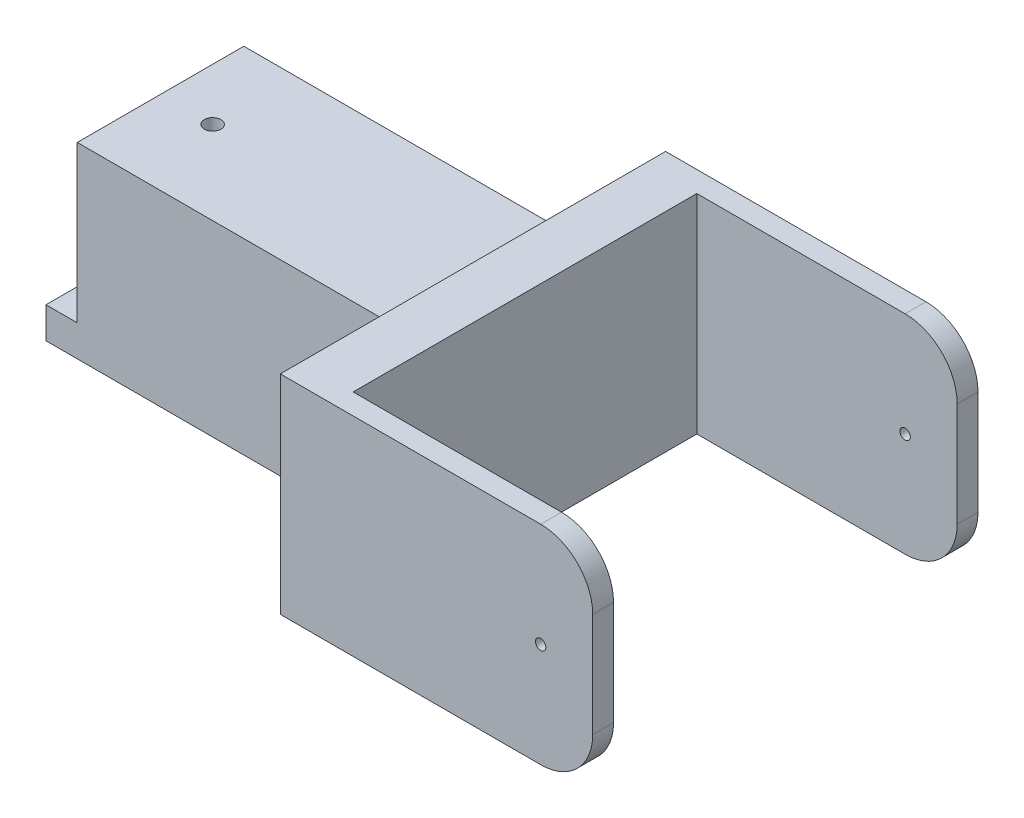
ISO-10303-21;
HEADER;
FILE_DESCRIPTION(('STEP AP214'),'2;1');
FILE_NAME('part.step','',(''),(''),'','','');
FILE_SCHEMA(('AUTOMOTIVE_DESIGN { 1 0 10303 214 1 1 1 1 }'));
ENDSEC;
DATA;
#1=APPLICATION_CONTEXT('core data for automotive mechanical design processes');
#2=APPLICATION_PROTOCOL_DEFINITION('international standard','automotive_design',2000,#1);
#3=PRODUCT_CONTEXT('',#1,'mechanical');
#4=PRODUCT('Part','Part','',(#3));
#5=PRODUCT_RELATED_PRODUCT_CATEGORY('part','',(#4));
#6=PRODUCT_DEFINITION_FORMATION('','',#4);
#7=PRODUCT_DEFINITION_CONTEXT('part definition',#1,'design');
#8=PRODUCT_DEFINITION('design','',#6,#7);
#9=PRODUCT_DEFINITION_SHAPE('','',#8);
#10=(LENGTH_UNIT() NAMED_UNIT(*) SI_UNIT(.MILLI.,.METRE.));
#11=(NAMED_UNIT(*) PLANE_ANGLE_UNIT() SI_UNIT($,.RADIAN.));
#12=(NAMED_UNIT(*) SI_UNIT($,.STERADIAN.) SOLID_ANGLE_UNIT());
#13=UNCERTAINTY_MEASURE_WITH_UNIT(LENGTH_MEASURE(1.E-05),#10,'distance_accuracy_value','');
#14=(GEOMETRIC_REPRESENTATION_CONTEXT(3) GLOBAL_UNCERTAINTY_ASSIGNED_CONTEXT((#13)) GLOBAL_UNIT_ASSIGNED_CONTEXT((#10,
#11,#12)) REPRESENTATION_CONTEXT('',''));
#15=CARTESIAN_POINT('',(0.,0.,0.));
#16=DIRECTION('',(0.,0.,1.));
#17=DIRECTION('',(1.,0.,0.));
#18=AXIS2_PLACEMENT_3D('',#15,#16,#17);
#19=CARTESIAN_POINT('',(20.,38.,0.));
#20=DIRECTION('',(1.,0.,0.));
#21=DIRECTION('',(0.,0.,-1.));
#22=AXIS2_PLACEMENT_3D('',#19,#20,#21);
#23=PLANE('',#22);
#24=DIRECTION('',(0.,0.,1.));
#25=VECTOR('',#24,1.);
#26=CARTESIAN_POINT('',(20.,19.,-18.5));
#27=LINE('',#26,#25);
#28=CARTESIAN_POINT('',(20.,19.,-16.5));
#29=VERTEX_POINT('',#28);
#30=CARTESIAN_POINT('',(20.,19.,16.5));
#31=VERTEX_POINT('',#30);
#32=EDGE_CURVE('E235',#29,#31,#27,.T.);
#33=ORIENTED_EDGE('',*,*,#32,.F.);
#34=DIRECTION('',(0.,1.,0.));
#35=VECTOR('',#34,1.);
#36=CARTESIAN_POINT('',(20.,19.,-16.5));
#37=LINE('',#36,#35);
#38=CARTESIAN_POINT('',(20.,39.,-16.5));
#39=VERTEX_POINT('',#38);
#40=EDGE_CURVE('E508',#29,#39,#37,.T.);
#41=ORIENTED_EDGE('',*,*,#40,.T.);
#42=DIRECTION('',(0.,0.,-1.));
#43=VECTOR('',#42,1.);
#44=CARTESIAN_POINT('',(20.,39.,-18.5));
#45=LINE('',#44,#43);
#46=CARTESIAN_POINT('',(20.,39.,16.5));
#47=VERTEX_POINT('',#46);
#48=EDGE_CURVE('E237',#47,#39,#45,.T.);
#49=ORIENTED_EDGE('',*,*,#48,.F.);
#50=DIRECTION('',(0.,-1.,0.));
#51=VECTOR('',#50,1.);
#52=CARTESIAN_POINT('',(20.,19.,16.5));
#53=LINE('',#52,#51);
#54=EDGE_CURVE('E220',#47,#31,#53,.T.);
#55=ORIENTED_EDGE('',*,*,#54,.T.);
#56=EDGE_LOOP('',(#33,#41,#49,#55));
#57=FACE_BOUND('',#56,.T.);
#58=ADVANCED_FACE('F41',(#57),#23,.T.);
#59=CARTESIAN_POINT('',(-15.,36.,8.00000000000001));
#60=DIRECTION('',(1.,0.,0.));
#61=DIRECTION('',(0.,0.,-1.));
#62=AXIS2_PLACEMENT_3D('',#59,#60,#61);
#63=PLANE('',#62);
#64=DIRECTION('',(0.,1.,0.));
#65=VECTOR('',#64,1.);
#66=CARTESIAN_POINT('',(-15.,36.,8.00000000000001));
#67=LINE('',#66,#65);
#68=CARTESIAN_POINT('',(-15.,23.,8.));
#69=VERTEX_POINT('',#68);
#70=CARTESIAN_POINT('',(-15.,38.,8.00000000000001));
#71=VERTEX_POINT('',#70);
#72=EDGE_CURVE('E449',#69,#71,#67,.T.);
#73=ORIENTED_EDGE('',*,*,#72,.T.);
#74=DIRECTION('',(0.,0.,1.));
#75=VECTOR('',#74,1.);
#76=CARTESIAN_POINT('',(-15.,38.,8.00000000000001));
#77=LINE('',#76,#75);
#78=CARTESIAN_POINT('',(-15.,38.,-7.99999999999999));
#79=VERTEX_POINT('',#78);
#80=EDGE_CURVE('E423',#79,#71,#77,.T.);
#81=ORIENTED_EDGE('',*,*,#80,.F.);
#82=DIRECTION('',(0.,1.,0.));
#83=VECTOR('',#82,1.);
#84=CARTESIAN_POINT('',(-15.,36.,-7.99999999999999));
#85=LINE('',#84,#83);
#86=CARTESIAN_POINT('',(-15.,23.,-8.));
#87=VERTEX_POINT('',#86);
#88=EDGE_CURVE('E437',#87,#79,#85,.T.);
#89=ORIENTED_EDGE('',*,*,#88,.F.);
#90=DIRECTION('',(0.,0.,-1.));
#91=VECTOR('',#90,1.);
#92=CARTESIAN_POINT('',(-15.,23.,8.));
#93=LINE('',#92,#91);
#94=CARTESIAN_POINT('',(-15.,23.,-2.25));
#95=VERTEX_POINT('',#94);
#96=EDGE_CURVE('E316',#95,#87,#93,.T.);
#97=ORIENTED_EDGE('',*,*,#96,.F.);
#98=DIRECTION('',(0.,1.,0.));
#99=VECTOR('',#98,1.);
#100=CARTESIAN_POINT('',(-15.,20.,-2.25));
#101=LINE('',#100,#99);
#102=CARTESIAN_POINT('',(-15.,33.,-2.24999999999999));
#103=VERTEX_POINT('',#102);
#104=EDGE_CURVE('E331',#95,#103,#101,.T.);
#105=ORIENTED_EDGE('',*,*,#104,.T.);
#106=DIRECTION('',(0.,0.,1.));
#107=VECTOR('',#106,1.);
#108=CARTESIAN_POINT('',(-15.,33.,-2.24999999999999));
#109=LINE('',#108,#107);
#110=CARTESIAN_POINT('',(-15.,33.,2.25000000000001));
#111=VERTEX_POINT('',#110);
#112=EDGE_CURVE('E359',#103,#111,#109,.T.);
#113=ORIENTED_EDGE('',*,*,#112,.T.);
#114=DIRECTION('',(0.,-1.,0.));
#115=VECTOR('',#114,1.);
#116=CARTESIAN_POINT('',(-15.,20.,2.25));
#117=LINE('',#116,#115);
#118=CARTESIAN_POINT('',(-15.,23.,2.25));
#119=VERTEX_POINT('',#118);
#120=EDGE_CURVE('E339',#111,#119,#117,.T.);
#121=ORIENTED_EDGE('',*,*,#120,.T.);
#122=EDGE_CURVE('E324',#69,#119,#93,.T.);
#123=ORIENTED_EDGE('',*,*,#122,.F.);
#124=EDGE_LOOP('',(#73,#81,#89,#97,#105,#113,#121,#123));
#125=FACE_BOUND('',#124,.T.);
#126=ADVANCED_FACE('F569',(#125),#63,.F.);
#127=CARTESIAN_POINT('',(15.,36.,8.00000000000001));
#128=DIRECTION('',(0.,0.,-1.));
#129=DIRECTION('',(-1.,0.,0.));
#130=AXIS2_PLACEMENT_3D('',#127,#128,#129);
#131=PLANE('',#130);
#132=DIRECTION('',(0.,1.,0.));
#133=VECTOR('',#132,1.);
#134=CARTESIAN_POINT('',(15.,36.,8.00000000000001));
#135=LINE('',#134,#133);
#136=CARTESIAN_POINT('',(15.,20.,8.));
#137=VERTEX_POINT('',#136);
#138=CARTESIAN_POINT('',(15.,38.,8.00000000000001));
#139=VERTEX_POINT('',#138);
#140=EDGE_CURVE('E445',#137,#139,#135,.T.);
#141=ORIENTED_EDGE('',*,*,#140,.T.);
#142=DIRECTION('',(1.,0.,0.));
#143=VECTOR('',#142,1.);
#144=CARTESIAN_POINT('',(15.,38.,8.00000000000001));
#145=LINE('',#144,#143);
#146=EDGE_CURVE('E427',#71,#139,#145,.T.);
#147=ORIENTED_EDGE('',*,*,#146,.F.);
#148=ORIENTED_EDGE('',*,*,#72,.F.);
#149=DIRECTION('',(1.,0.,0.));
#150=VECTOR('',#149,1.);
#151=CARTESIAN_POINT('',(-13.,23.,8.));
#152=LINE('',#151,#150);
#153=CARTESIAN_POINT('',(-18.,23.,8.));
#154=VERTEX_POINT('',#153);
#155=EDGE_CURVE('E306',#154,#69,#152,.T.);
#156=ORIENTED_EDGE('',*,*,#155,.F.);
#157=DIRECTION('',(0.,-1.,0.));
#158=VECTOR('',#157,1.);
#159=CARTESIAN_POINT('',(-18.,23.,8.));
#160=LINE('',#159,#158);
#161=CARTESIAN_POINT('',(-18.,20.,8.));
#162=VERTEX_POINT('',#161);
#163=EDGE_CURVE('E312',#154,#162,#160,.T.);
#164=ORIENTED_EDGE('',*,*,#163,.T.);
#165=DIRECTION('',(1.,0.,0.));
#166=VECTOR('',#165,1.);
#167=CARTESIAN_POINT('',(-15.,20.,8.));
#168=LINE('',#167,#166);
#169=EDGE_CURVE('E412',#162,#137,#168,.T.);
#170=ORIENTED_EDGE('',*,*,#169,.T.);
#171=EDGE_LOOP('',(#141,#147,#148,#156,#164,#170));
#172=FACE_BOUND('',#171,.T.);
#173=ADVANCED_FACE('F574',(#172),#131,.F.);
#174=CARTESIAN_POINT('',(15.,36.,-7.99999999999999));
#175=DIRECTION('',(0.,0.,1.));
#176=DIRECTION('',(1.,0.,0.));
#177=AXIS2_PLACEMENT_3D('',#174,#175,#176);
#178=PLANE('',#177);
#179=DIRECTION('',(0.,-1.,0.));
#180=VECTOR('',#179,1.);
#181=CARTESIAN_POINT('',(-18.,23.,-8.));
#182=LINE('',#181,#180);
#183=CARTESIAN_POINT('',(-18.,23.,-8.));
#184=VERTEX_POINT('',#183);
#185=CARTESIAN_POINT('',(-18.,20.,-8.));
#186=VERTEX_POINT('',#185);
#187=EDGE_CURVE('E309',#184,#186,#182,.T.);
#188=ORIENTED_EDGE('',*,*,#187,.F.);
#189=DIRECTION('',(-1.,0.,0.));
#190=VECTOR('',#189,1.);
#191=CARTESIAN_POINT('',(-13.,23.,-8.));
#192=LINE('',#191,#190);
#193=EDGE_CURVE('E299',#87,#184,#192,.T.);
#194=ORIENTED_EDGE('',*,*,#193,.F.);
#195=ORIENTED_EDGE('',*,*,#88,.T.);
#196=DIRECTION('',(-1.,0.,0.));
#197=VECTOR('',#196,1.);
#198=CARTESIAN_POINT('',(15.,38.,-7.99999999999999));
#199=LINE('',#198,#197);
#200=CARTESIAN_POINT('',(15.,38.,-7.99999999999999));
#201=VERTEX_POINT('',#200);
#202=EDGE_CURVE('E434',#201,#79,#199,.T.);
#203=ORIENTED_EDGE('',*,*,#202,.F.);
#204=DIRECTION('',(0.,1.,0.));
#205=VECTOR('',#204,1.);
#206=CARTESIAN_POINT('',(15.,36.,-7.99999999999999));
#207=LINE('',#206,#205);
#208=CARTESIAN_POINT('',(15.,20.,-8.));
#209=VERTEX_POINT('',#208);
#210=EDGE_CURVE('E441',#209,#201,#207,.T.);
#211=ORIENTED_EDGE('',*,*,#210,.F.);
#212=DIRECTION('',(-1.,0.,0.));
#213=VECTOR('',#212,1.);
#214=CARTESIAN_POINT('',(10.2,20.,-8.));
#215=LINE('',#214,#213);
#216=EDGE_CURVE('E419',#209,#186,#215,.T.);
#217=ORIENTED_EDGE('',*,*,#216,.T.);
#218=EDGE_LOOP('',(#188,#194,#195,#203,#211,#217));
#219=FACE_BOUND('',#218,.T.);
#220=ADVANCED_FACE('F658',(#219),#178,.F.);
#221=CARTESIAN_POINT('',(0.,38.,0.));
#222=DIRECTION('',(0.,-1.,0.));
#223=DIRECTION('',(0.,0.,1.));
#224=AXIS2_PLACEMENT_3D('',#221,#222,#223);
#225=PLANE('',#224);
#226=CARTESIAN_POINT('',(-10.,38.,0.));
#227=DIRECTION('',(0.,-1.,0.));
#228=DIRECTION('',(0.,0.,-1.));
#229=AXIS2_PLACEMENT_3D('',#226,#227,#228);
#230=CIRCLE('',#229,0.800000000000001);
#231=CARTESIAN_POINT('',(-10.,38.,-0.799999999999994));
#232=VERTEX_POINT('',#231);
#233=EDGE_CURVE('E332',#232,#232,#230,.T.);
#234=ORIENTED_EDGE('',*,*,#233,.T.);
#235=EDGE_LOOP('',(#234));
#236=FACE_BOUND('',#235,.T.);
#237=ORIENTED_EDGE('',*,*,#80,.T.);
#238=ORIENTED_EDGE('',*,*,#146,.T.);
#239=DIRECTION('',(0.,0.,-1.));
#240=VECTOR('',#239,1.);
#241=CARTESIAN_POINT('',(15.,38.,8.00000000000001));
#242=LINE('',#241,#240);
#243=EDGE_CURVE('E431',#139,#201,#242,.T.);
#244=ORIENTED_EDGE('',*,*,#243,.T.);
#245=ORIENTED_EDGE('',*,*,#202,.T.);
#246=EDGE_LOOP('',(#237,#238,#244,#245));
#247=FACE_BOUND('',#246,.T.);
#248=ADVANCED_FACE('F651',(#236,#247),#225,.F.);
#249=CARTESIAN_POINT('',(0.,20.,0.));
#250=DIRECTION('',(0.,-1.,0.));
#251=DIRECTION('',(0.,0.,1.));
#252=AXIS2_PLACEMENT_3D('',#249,#250,#251);
#253=PLANE('',#252);
#254=CARTESIAN_POINT('',(-15.5009715513472,20.,0.));
#255=DIRECTION('',(0.,1.,0.));
#256=DIRECTION('',(0.,0.,1.));
#257=AXIS2_PLACEMENT_3D('',#254,#255,#256);
#258=CIRCLE('',#257,0.800000000000001);
#259=CARTESIAN_POINT('',(-15.5009715513472,20.,0.800000000000001));
#260=VERTEX_POINT('',#259);
#261=EDGE_CURVE('E281',#260,#260,#258,.T.);
#262=ORIENTED_EDGE('',*,*,#261,.T.);
#263=EDGE_LOOP('',(#262));
#264=FACE_BOUND('',#263,.T.);
#265=CARTESIAN_POINT('',(12.,20.,0.));
#266=DIRECTION('',(0.,1.,0.));
#267=DIRECTION('',(0.,0.,1.));
#268=AXIS2_PLACEMENT_3D('',#265,#266,#267);
#269=CIRCLE('',#268,0.800000000000001);
#270=CARTESIAN_POINT('',(12.,20.,0.800000000000001));
#271=VERTEX_POINT('',#270);
#272=EDGE_CURVE('E291',#271,#271,#269,.T.);
#273=ORIENTED_EDGE('',*,*,#272,.T.);
#274=EDGE_LOOP('',(#273));
#275=FACE_BOUND('',#274,.T.);
#276=DIRECTION('',(-1.,0.,0.));
#277=VECTOR('',#276,1.);
#278=CARTESIAN_POINT('',(-13.,20.,-6.1));
#279=LINE('',#278,#277);
#280=CARTESIAN_POINT('',(10.2,20.,-6.1));
#281=VERTEX_POINT('',#280);
#282=CARTESIAN_POINT('',(-13.,20.,-6.1));
#283=VERTEX_POINT('',#282);
#284=EDGE_CURVE('E370',#281,#283,#279,.T.);
#285=ORIENTED_EDGE('',*,*,#284,.T.);
#286=DIRECTION('',(0.,0.,1.));
#287=VECTOR('',#286,1.);
#288=CARTESIAN_POINT('',(-13.,20.,-6.1));
#289=LINE('',#288,#287);
#290=CARTESIAN_POINT('',(-13.,20.,6.1));
#291=VERTEX_POINT('',#290);
#292=EDGE_CURVE('E375',#283,#291,#289,.T.);
#293=ORIENTED_EDGE('',*,*,#292,.T.);
#294=DIRECTION('',(1.,0.,0.));
#295=VECTOR('',#294,1.);
#296=CARTESIAN_POINT('',(-13.,20.,6.1));
#297=LINE('',#296,#295);
#298=CARTESIAN_POINT('',(10.2,20.,6.1));
#299=VERTEX_POINT('',#298);
#300=EDGE_CURVE('E379',#291,#299,#297,.T.);
#301=ORIENTED_EDGE('',*,*,#300,.T.);
#302=DIRECTION('',(0.,0.,-1.));
#303=VECTOR('',#302,1.);
#304=CARTESIAN_POINT('',(10.2,20.,-6.1));
#305=LINE('',#304,#303);
#306=EDGE_CURVE('E366',#299,#281,#305,.T.);
#307=ORIENTED_EDGE('',*,*,#306,.T.);
#308=EDGE_LOOP('',(#285,#293,#301,#307));
#309=FACE_BOUND('',#308,.T.);
#310=ORIENTED_EDGE('',*,*,#216,.F.);
#311=DIRECTION('',(0.,0.,-1.));
#312=VECTOR('',#311,1.);
#313=CARTESIAN_POINT('',(15.,20.,-8.));
#314=LINE('',#313,#312);
#315=EDGE_CURVE('E416',#137,#209,#314,.T.);
#316=ORIENTED_EDGE('',*,*,#315,.F.);
#317=ORIENTED_EDGE('',*,*,#169,.F.);
#318=DIRECTION('',(0.,0.,1.));
#319=VECTOR('',#318,1.);
#320=CARTESIAN_POINT('',(-18.,20.,-8.));
#321=LINE('',#320,#319);
#322=EDGE_CURVE('E290',#186,#162,#321,.T.);
#323=ORIENTED_EDGE('',*,*,#322,.F.);
#324=EDGE_LOOP('',(#310,#316,#317,#323));
#325=FACE_BOUND('',#324,.T.);
#326=ADVANCED_FACE('F647',(#264,#275,#309,#325),#253,.T.);
#327=CARTESIAN_POINT('',(10.2,20.,-6.1));
#328=DIRECTION('',(-1.,0.,0.));
#329=DIRECTION('',(0.,0.,1.));
#330=AXIS2_PLACEMENT_3D('',#327,#328,#329);
#331=PLANE('',#330);
#332=DIRECTION('',(0.,1.,0.));
#333=VECTOR('',#332,1.);
#334=CARTESIAN_POINT('',(10.2,20.,-6.1));
#335=LINE('',#334,#333);
#336=CARTESIAN_POINT('',(10.2,36.,-6.1));
#337=VERTEX_POINT('',#336);
#338=EDGE_CURVE('E408',#281,#337,#335,.T.);
#339=ORIENTED_EDGE('',*,*,#338,.F.);
#340=ORIENTED_EDGE('',*,*,#306,.F.);
#341=DIRECTION('',(0.,1.,0.));
#342=VECTOR('',#341,1.);
#343=CARTESIAN_POINT('',(10.2,20.,6.1));
#344=LINE('',#343,#342);
#345=CARTESIAN_POINT('',(10.2,36.,6.10000000000001));
#346=VERTEX_POINT('',#345);
#347=EDGE_CURVE('E383',#299,#346,#344,.T.);
#348=ORIENTED_EDGE('',*,*,#347,.T.);
#349=DIRECTION('',(0.,0.,-1.));
#350=VECTOR('',#349,1.);
#351=CARTESIAN_POINT('',(10.2,36.,-6.1));
#352=LINE('',#351,#350);
#353=EDGE_CURVE('E365',#346,#337,#352,.T.);
#354=ORIENTED_EDGE('',*,*,#353,.T.);
#355=EDGE_LOOP('',(#339,#340,#348,#354));
#356=FACE_BOUND('',#355,.T.);
#357=ADVANCED_FACE('F643',(#356),#331,.T.);
#358=CARTESIAN_POINT('',(-13.,20.,-6.1));
#359=DIRECTION('',(0.,0.,1.));
#360=DIRECTION('',(1.,0.,0.));
#361=AXIS2_PLACEMENT_3D('',#358,#359,#360);
#362=PLANE('',#361);
#363=DIRECTION('',(-1.,0.,0.));
#364=VECTOR('',#363,1.);
#365=CARTESIAN_POINT('',(-13.,36.,-6.1));
#366=LINE('',#365,#364);
#367=CARTESIAN_POINT('',(-13.,36.,-6.1));
#368=VERTEX_POINT('',#367);
#369=EDGE_CURVE('E387',#337,#368,#366,.T.);
#370=ORIENTED_EDGE('',*,*,#369,.T.);
#371=DIRECTION('',(0.,1.,0.));
#372=VECTOR('',#371,1.);
#373=CARTESIAN_POINT('',(-13.,20.,-6.1));
#374=LINE('',#373,#372);
#375=EDGE_CURVE('E404',#283,#368,#374,.T.);
#376=ORIENTED_EDGE('',*,*,#375,.F.);
#377=ORIENTED_EDGE('',*,*,#284,.F.);
#378=ORIENTED_EDGE('',*,*,#338,.T.);
#379=EDGE_LOOP('',(#370,#376,#377,#378));
#380=FACE_BOUND('',#379,.T.);
#381=ADVANCED_FACE('F639',(#380),#362,.T.);
#382=CARTESIAN_POINT('',(-13.,20.,-6.1));
#383=DIRECTION('',(1.,0.,0.));
#384=DIRECTION('',(0.,0.,-1.));
#385=AXIS2_PLACEMENT_3D('',#382,#383,#384);
#386=PLANE('',#385);
#387=DIRECTION('',(0.,1.,0.));
#388=VECTOR('',#387,1.);
#389=CARTESIAN_POINT('',(-13.,20.,2.25));
#390=LINE('',#389,#388);
#391=CARTESIAN_POINT('',(-13.,23.,2.25));
#392=VERTEX_POINT('',#391);
#393=CARTESIAN_POINT('',(-13.,33.,2.25000000000001));
#394=VERTEX_POINT('',#393);
#395=EDGE_CURVE('E343',#392,#394,#390,.T.);
#396=ORIENTED_EDGE('',*,*,#395,.T.);
#397=DIRECTION('',(0.,0.,-1.));
#398=VECTOR('',#397,1.);
#399=CARTESIAN_POINT('',(-13.,33.,-2.24999999999999));
#400=LINE('',#399,#398);
#401=CARTESIAN_POINT('',(-13.,33.,-2.24999999999999));
#402=VERTEX_POINT('',#401);
#403=EDGE_CURVE('E347',#394,#402,#400,.T.);
#404=ORIENTED_EDGE('',*,*,#403,.T.);
#405=DIRECTION('',(0.,-1.,0.));
#406=VECTOR('',#405,1.);
#407=CARTESIAN_POINT('',(-13.,20.,-2.25));
#408=LINE('',#407,#406);
#409=CARTESIAN_POINT('',(-13.,23.,-2.25));
#410=VERTEX_POINT('',#409);
#411=EDGE_CURVE('E351',#402,#410,#408,.T.);
#412=ORIENTED_EDGE('',*,*,#411,.T.);
#413=DIRECTION('',(0.,0.,-1.));
#414=VECTOR('',#413,1.);
#415=CARTESIAN_POINT('',(-13.,23.,-8.));
#416=LINE('',#415,#414);
#417=EDGE_CURVE('E295',#392,#410,#416,.T.);
#418=ORIENTED_EDGE('',*,*,#417,.F.);
#419=EDGE_LOOP('',(#396,#404,#412,#418));
#420=FACE_BOUND('',#419,.T.);
#421=DIRECTION('',(0.,1.,0.));
#422=VECTOR('',#421,1.);
#423=CARTESIAN_POINT('',(-13.,20.,6.1));
#424=LINE('',#423,#422);
#425=CARTESIAN_POINT('',(-13.,36.,6.10000000000001));
#426=VERTEX_POINT('',#425);
#427=EDGE_CURVE('E400',#291,#426,#424,.T.);
#428=ORIENTED_EDGE('',*,*,#427,.F.);
#429=ORIENTED_EDGE('',*,*,#292,.F.);
#430=ORIENTED_EDGE('',*,*,#375,.T.);
#431=DIRECTION('',(0.,0.,1.));
#432=VECTOR('',#431,1.);
#433=CARTESIAN_POINT('',(-13.,36.,-6.1));
#434=LINE('',#433,#432);
#435=EDGE_CURVE('E391',#368,#426,#434,.T.);
#436=ORIENTED_EDGE('',*,*,#435,.T.);
#437=EDGE_LOOP('',(#428,#429,#430,#436));
#438=FACE_BOUND('',#437,.T.);
#439=ADVANCED_FACE('F635',(#420,#438),#386,.T.);
#440=CARTESIAN_POINT('',(-13.,20.,6.1));
#441=DIRECTION('',(0.,0.,-1.));
#442=DIRECTION('',(-1.,0.,0.));
#443=AXIS2_PLACEMENT_3D('',#440,#441,#442);
#444=PLANE('',#443);
#445=DIRECTION('',(1.,0.,0.));
#446=VECTOR('',#445,1.);
#447=CARTESIAN_POINT('',(-13.,36.,6.10000000000001));
#448=LINE('',#447,#446);
#449=EDGE_CURVE('E371',#426,#346,#448,.T.);
#450=ORIENTED_EDGE('',*,*,#449,.T.);
#451=ORIENTED_EDGE('',*,*,#347,.F.);
#452=ORIENTED_EDGE('',*,*,#300,.F.);
#453=ORIENTED_EDGE('',*,*,#427,.T.);
#454=EDGE_LOOP('',(#450,#451,#452,#453));
#455=FACE_BOUND('',#454,.T.);
#456=ADVANCED_FACE('F632',(#455),#444,.T.);
#457=CARTESIAN_POINT('',(0.,36.,0.));
#458=DIRECTION('',(0.,-1.,0.));
#459=DIRECTION('',(0.,0.,1.));
#460=AXIS2_PLACEMENT_3D('',#457,#458,#459);
#461=PLANE('',#460);
#462=CARTESIAN_POINT('',(-10.,36.,0.));
#463=DIRECTION('',(0.,-1.,0.));
#464=DIRECTION('',(0.,0.,-1.));
#465=AXIS2_PLACEMENT_3D('',#462,#463,#464);
#466=CIRCLE('',#465,0.800000000000001);
#467=CARTESIAN_POINT('',(-10.,36.,-0.799999999999994));
#468=VERTEX_POINT('',#467);
#469=EDGE_CURVE('E327',#468,#468,#466,.T.);
#470=ORIENTED_EDGE('',*,*,#469,.F.);
#471=EDGE_LOOP('',(#470));
#472=FACE_BOUND('',#471,.T.);
#473=ORIENTED_EDGE('',*,*,#353,.F.);
#474=ORIENTED_EDGE('',*,*,#449,.F.);
#475=ORIENTED_EDGE('',*,*,#435,.F.);
#476=ORIENTED_EDGE('',*,*,#369,.F.);
#477=EDGE_LOOP('',(#473,#474,#475,#476));
#478=FACE_BOUND('',#477,.T.);
#479=ADVANCED_FACE('F630',(#472,#478),#461,.T.);
#480=CARTESIAN_POINT('',(-15.001,20.,2.25));
#481=DIRECTION('',(0.,0.,1.));
#482=DIRECTION('',(0.,1.,0.));
#483=AXIS2_PLACEMENT_3D('',#480,#481,#482);
#484=PLANE('',#483);
#485=ORIENTED_EDGE('',*,*,#120,.F.);
#486=DIRECTION('',(1.,0.,0.));
#487=VECTOR('',#486,1.);
#488=CARTESIAN_POINT('',(-15.001,33.,2.25000000000001));
#489=LINE('',#488,#487);
#490=EDGE_CURVE('E355',#111,#394,#489,.T.);
#491=ORIENTED_EDGE('',*,*,#490,.T.);
#492=ORIENTED_EDGE('',*,*,#395,.F.);
#493=DIRECTION('',(1.,0.,0.));
#494=VECTOR('',#493,1.);
#495=CARTESIAN_POINT('',(-15.001,23.,2.25));
#496=LINE('',#495,#494);
#497=EDGE_CURVE('E323',#119,#392,#496,.T.);
#498=ORIENTED_EDGE('',*,*,#497,.F.);
#499=EDGE_LOOP('',(#485,#491,#492,#498));
#500=FACE_BOUND('',#499,.T.);
#501=ADVANCED_FACE('F623',(#500),#484,.F.);
#502=CARTESIAN_POINT('',(-15.001,20.,-2.25));
#503=DIRECTION('',(0.,0.,-1.));
#504=DIRECTION('',(0.,-1.,0.));
#505=AXIS2_PLACEMENT_3D('',#502,#503,#504);
#506=PLANE('',#505);
#507=ORIENTED_EDGE('',*,*,#411,.F.);
#508=DIRECTION('',(1.,0.,0.));
#509=VECTOR('',#508,1.);
#510=CARTESIAN_POINT('',(-15.001,33.,-2.24999999999999));
#511=LINE('',#510,#509);
#512=EDGE_CURVE('E356',#103,#402,#511,.T.);
#513=ORIENTED_EDGE('',*,*,#512,.F.);
#514=ORIENTED_EDGE('',*,*,#104,.F.);
#515=DIRECTION('',(-1.,0.,0.));
#516=VECTOR('',#515,1.);
#517=CARTESIAN_POINT('',(-15.001,23.,-2.25));
#518=LINE('',#517,#516);
#519=EDGE_CURVE('E453',#410,#95,#518,.T.);
#520=ORIENTED_EDGE('',*,*,#519,.F.);
#521=EDGE_LOOP('',(#507,#513,#514,#520));
#522=FACE_BOUND('',#521,.T.);
#523=ADVANCED_FACE('F620',(#522),#506,.F.);
#524=CARTESIAN_POINT('',(-15.001,33.,-2.24999999999999));
#525=DIRECTION('',(0.,1.,0.));
#526=DIRECTION('',(0.,0.,-1.));
#527=AXIS2_PLACEMENT_3D('',#524,#525,#526);
#528=PLANE('',#527);
#529=ORIENTED_EDGE('',*,*,#112,.F.);
#530=ORIENTED_EDGE('',*,*,#512,.T.);
#531=ORIENTED_EDGE('',*,*,#403,.F.);
#532=ORIENTED_EDGE('',*,*,#490,.F.);
#533=EDGE_LOOP('',(#529,#530,#531,#532));
#534=FACE_BOUND('',#533,.T.);
#535=ADVANCED_FACE('F618',(#534),#528,.F.);
#536=CARTESIAN_POINT('',(-10.,36.,0.));
#537=DIRECTION('',(0.,1.,0.));
#538=DIRECTION('',(0.,0.,-1.));
#539=AXIS2_PLACEMENT_3D('',#536,#537,#538);
#540=CYLINDRICAL_SURFACE('',#539,0.800000000000001);
#541=ORIENTED_EDGE('',*,*,#469,.T.);
#542=EDGE_LOOP('',(#541));
#543=FACE_BOUND('',#542,.T.);
#544=ORIENTED_EDGE('',*,*,#233,.F.);
#545=EDGE_LOOP('',(#544));
#546=FACE_BOUND('',#545,.T.);
#547=ADVANCED_FACE('F611',(#543,#546),#540,.F.);
#548=CARTESIAN_POINT('',(0.,23.,0.));
#549=DIRECTION('',(0.,1.,0.));
#550=DIRECTION('',(0.,0.,-1.));
#551=AXIS2_PLACEMENT_3D('',#548,#549,#550);
#552=PLANE('',#551);
#553=CARTESIAN_POINT('',(-15.5009715513472,23.,0.));
#554=DIRECTION('',(0.,-1.,0.));
#555=DIRECTION('',(0.,0.,-1.));
#556=AXIS2_PLACEMENT_3D('',#553,#554,#555);
#557=CIRCLE('',#556,0.800000000000001);
#558=CARTESIAN_POINT('',(-15.5009715513472,23.,-0.799999999999999));
#559=VERTEX_POINT('',#558);
#560=EDGE_CURVE('E285',#559,#559,#557,.T.);
#561=ORIENTED_EDGE('',*,*,#560,.T.);
#562=EDGE_LOOP('',(#561));
#563=FACE_BOUND('',#562,.T.);
#564=ORIENTED_EDGE('',*,*,#122,.T.);
#565=ORIENTED_EDGE('',*,*,#497,.T.);
#566=ORIENTED_EDGE('',*,*,#417,.T.);
#567=ORIENTED_EDGE('',*,*,#519,.T.);
#568=ORIENTED_EDGE('',*,*,#96,.T.);
#569=ORIENTED_EDGE('',*,*,#193,.T.);
#570=DIRECTION('',(0.,0.,1.));
#571=VECTOR('',#570,1.);
#572=CARTESIAN_POINT('',(-18.,23.,-8.));
#573=LINE('',#572,#571);
#574=EDGE_CURVE('E303',#184,#154,#573,.T.);
#575=ORIENTED_EDGE('',*,*,#574,.T.);
#576=ORIENTED_EDGE('',*,*,#155,.T.);
#577=EDGE_LOOP('',(#564,#565,#566,#567,#568,#569,#575,#576));
#578=FACE_BOUND('',#577,.T.);
#579=ADVANCED_FACE('F608',(#563,#578),#552,.T.);
#580=CARTESIAN_POINT('',(-18.,23.,-8.));
#581=DIRECTION('',(-1.,0.,0.));
#582=DIRECTION('',(0.,0.,1.));
#583=AXIS2_PLACEMENT_3D('',#580,#581,#582);
#584=PLANE('',#583);
#585=ORIENTED_EDGE('',*,*,#322,.T.);
#586=ORIENTED_EDGE('',*,*,#163,.F.);
#587=ORIENTED_EDGE('',*,*,#574,.F.);
#588=ORIENTED_EDGE('',*,*,#187,.T.);
#589=EDGE_LOOP('',(#585,#586,#587,#588));
#590=FACE_BOUND('',#589,.T.);
#591=ADVANCED_FACE('F606',(#590),#584,.T.);
#592=CARTESIAN_POINT('',(12.,25.,0.));
#593=DIRECTION('',(0.,-1.,0.));
#594=DIRECTION('',(0.,0.,1.));
#595=AXIS2_PLACEMENT_3D('',#592,#593,#594);
#596=CYLINDRICAL_SURFACE('',#595,0.800000000000001);
#597=CARTESIAN_POINT('',(12.,25.,0.));
#598=DIRECTION('',(0.,1.,0.));
#599=DIRECTION('',(0.,0.,1.));
#600=AXIS2_PLACEMENT_3D('',#597,#598,#599);
#601=CIRCLE('',#600,0.800000000000001);
#602=CARTESIAN_POINT('',(12.,25.,0.800000000000003));
#603=VERTEX_POINT('',#602);
#604=EDGE_CURVE('E286',#603,#603,#601,.T.);
#605=ORIENTED_EDGE('',*,*,#604,.T.);
#606=EDGE_LOOP('',(#605));
#607=FACE_BOUND('',#606,.T.);
#608=ORIENTED_EDGE('',*,*,#272,.F.);
#609=EDGE_LOOP('',(#608));
#610=FACE_BOUND('',#609,.T.);
#611=ADVANCED_FACE('F602',(#607,#610),#596,.F.);
#612=CARTESIAN_POINT('',(12.,25.,0.));
#613=DIRECTION('',(0.,-1.,0.));
#614=DIRECTION('',(0.,0.,1.));
#615=AXIS2_PLACEMENT_3D('',#612,#613,#614);
#616=PLANE('',#615);
#617=ORIENTED_EDGE('',*,*,#604,.F.);
#618=EDGE_LOOP('',(#617));
#619=FACE_BOUND('',#618,.T.);
#620=ADVANCED_FACE('F598',(#619),#616,.T.);
#621=CARTESIAN_POINT('',(-15.5009715513472,25.,0.));
#622=DIRECTION('',(0.,-1.,0.));
#623=DIRECTION('',(0.,0.,1.));
#624=AXIS2_PLACEMENT_3D('',#621,#622,#623);
#625=CYLINDRICAL_SURFACE('',#624,0.800000000000001);
#626=ORIENTED_EDGE('',*,*,#560,.F.);
#627=EDGE_LOOP('',(#626));
#628=FACE_BOUND('',#627,.T.);
#629=ORIENTED_EDGE('',*,*,#261,.F.);
#630=EDGE_LOOP('',(#629));
#631=FACE_BOUND('',#630,.T.);
#632=ADVANCED_FACE('F583',(#628,#631),#625,.F.);
#633=CARTESIAN_POINT('',(15.,38.,0.));
#634=DIRECTION('',(1.,0.,0.));
#635=DIRECTION('',(0.,0.,-1.));
#636=AXIS2_PLACEMENT_3D('',#633,#634,#635);
#637=PLANE('',#636);
#638=DIRECTION('',(0.,1.,0.));
#639=VECTOR('',#638,1.);
#640=CARTESIAN_POINT('',(15.,39.,18.5));
#641=LINE('',#640,#639);
#642=CARTESIAN_POINT('',(15.,19.,18.5));
#643=VERTEX_POINT('',#642);
#644=CARTESIAN_POINT('',(15.,39.,18.5));
#645=VERTEX_POINT('',#644);
#646=EDGE_CURVE('E258',#643,#645,#641,.T.);
#647=ORIENTED_EDGE('',*,*,#646,.T.);
#648=DIRECTION('',(0.,0.,-1.));
#649=VECTOR('',#648,1.);
#650=CARTESIAN_POINT('',(15.,39.,-18.5));
#651=LINE('',#650,#649);
#652=CARTESIAN_POINT('',(15.,39.,-18.5));
#653=VERTEX_POINT('',#652);
#654=EDGE_CURVE('E262',#645,#653,#651,.T.);
#655=ORIENTED_EDGE('',*,*,#654,.T.);
#656=DIRECTION('',(0.,-1.,0.));
#657=VECTOR('',#656,1.);
#658=CARTESIAN_POINT('',(15.,39.,-18.5));
#659=LINE('',#658,#657);
#660=CARTESIAN_POINT('',(15.,19.,-18.5));
#661=VERTEX_POINT('',#660);
#662=EDGE_CURVE('E266',#653,#661,#659,.T.);
#663=ORIENTED_EDGE('',*,*,#662,.T.);
#664=DIRECTION('',(0.,0.,1.));
#665=VECTOR('',#664,1.);
#666=CARTESIAN_POINT('',(15.,19.,-18.5));
#667=LINE('',#666,#665);
#668=EDGE_CURVE('E254',#661,#643,#667,.T.);
#669=ORIENTED_EDGE('',*,*,#668,.T.);
#670=EDGE_LOOP('',(#647,#655,#663,#669));
#671=FACE_BOUND('',#670,.T.);
#672=ORIENTED_EDGE('',*,*,#140,.F.);
#673=ORIENTED_EDGE('',*,*,#315,.T.);
#674=ORIENTED_EDGE('',*,*,#210,.T.);
#675=ORIENTED_EDGE('',*,*,#243,.F.);
#676=EDGE_LOOP('',(#672,#673,#674,#675));
#677=FACE_BOUND('',#676,.T.);
#678=ADVANCED_FACE('F579',(#671,#677),#637,.F.);
#679=CARTESIAN_POINT('',(20.,39.,18.5));
#680=DIRECTION('',(0.,0.,-1.));
#681=DIRECTION('',(-1.,0.,0.));
#682=AXIS2_PLACEMENT_3D('',#679,#680,#681);
#683=PLANE('',#682);
#684=CARTESIAN_POINT('',(40.,29.,18.5));
#685=DIRECTION('',(0.,0.,1.));
#686=DIRECTION('',(-1.,0.,0.));
#687=AXIS2_PLACEMENT_3D('',#684,#685,#686);
#688=CIRCLE('',#687,0.499999999999999);
#689=CARTESIAN_POINT('',(39.5,29.,18.5));
#690=VERTEX_POINT('',#689);
#691=EDGE_CURVE('E545',#690,#690,#688,.T.);
#692=ORIENTED_EDGE('',*,*,#691,.F.);
#693=EDGE_LOOP('',(#692));
#694=FACE_BOUND('',#693,.T.);
#695=DIRECTION('',(0.,1.,0.));
#696=VECTOR('',#695,1.);
#697=CARTESIAN_POINT('',(45.,19.,18.5));
#698=LINE('',#697,#696);
#699=CARTESIAN_POINT('',(45.,24.,18.5));
#700=VERTEX_POINT('',#699);
#701=CARTESIAN_POINT('',(45.,34.,18.5));
#702=VERTEX_POINT('',#701);
#703=EDGE_CURVE('E239',#700,#702,#698,.T.);
#704=ORIENTED_EDGE('',*,*,#703,.T.);
#705=CARTESIAN_POINT('',(40.,34.,18.5));
#706=DIRECTION('',(0.,0.,1.));
#707=DIRECTION('',(-1.,0.,0.));
#708=AXIS2_PLACEMENT_3D('',#705,#706,#707);
#709=CIRCLE('',#708,5.);
#710=CARTESIAN_POINT('',(40.,39.,18.5));
#711=VERTEX_POINT('',#710);
#712=EDGE_CURVE('E465',#711,#702,#709,.F.);
#713=ORIENTED_EDGE('',*,*,#712,.F.);
#714=DIRECTION('',(-1.,0.,0.));
#715=VECTOR('',#714,1.);
#716=CARTESIAN_POINT('',(20.,39.,18.5));
#717=LINE('',#716,#715);
#718=EDGE_CURVE('E278',#711,#645,#717,.T.);
#719=ORIENTED_EDGE('',*,*,#718,.T.);
#720=ORIENTED_EDGE('',*,*,#646,.F.);
#721=DIRECTION('',(-1.,0.,0.));
#722=VECTOR('',#721,1.);
#723=CARTESIAN_POINT('',(20.,19.,18.5));
#724=LINE('',#723,#722);
#725=CARTESIAN_POINT('',(40.,19.,18.5));
#726=VERTEX_POINT('',#725);
#727=EDGE_CURVE('E248',#726,#643,#724,.T.);
#728=ORIENTED_EDGE('',*,*,#727,.F.);
#729=CARTESIAN_POINT('',(40.,24.,18.5));
#730=DIRECTION('',(0.,0.,1.));
#731=DIRECTION('',(-1.,0.,0.));
#732=AXIS2_PLACEMENT_3D('',#729,#730,#731);
#733=CIRCLE('',#732,5.);
#734=EDGE_CURVE('E469',#700,#726,#733,.F.);
#735=ORIENTED_EDGE('',*,*,#734,.F.);
#736=EDGE_LOOP('',(#704,#713,#719,#720,#728,#735));
#737=FACE_BOUND('',#736,.T.);
#738=ADVANCED_FACE('F582',(#694,#737),#683,.F.);
#739=CARTESIAN_POINT('',(20.,39.,-18.5));
#740=DIRECTION('',(0.,-1.,0.));
#741=DIRECTION('',(0.,0.,1.));
#742=AXIS2_PLACEMENT_3D('',#739,#740,#741);
#743=PLANE('',#742);
#744=DIRECTION('',(-1.,0.,0.));
#745=VECTOR('',#744,1.);
#746=CARTESIAN_POINT('',(45.,39.,16.5));
#747=LINE('',#746,#745);
#748=CARTESIAN_POINT('',(40.,39.,16.5));
#749=VERTEX_POINT('',#748);
#750=EDGE_CURVE('E229',#749,#47,#747,.T.);
#751=ORIENTED_EDGE('',*,*,#750,.T.);
#752=ORIENTED_EDGE('',*,*,#48,.T.);
#753=DIRECTION('',(-1.,0.,0.));
#754=VECTOR('',#753,1.);
#755=CARTESIAN_POINT('',(45.,39.,-16.5));
#756=LINE('',#755,#754);
#757=CARTESIAN_POINT('',(40.,39.,-16.5));
#758=VERTEX_POINT('',#757);
#759=EDGE_CURVE('E510',#758,#39,#756,.T.);
#760=ORIENTED_EDGE('',*,*,#759,.F.);
#761=DIRECTION('',(0.,0.,-1.));
#762=VECTOR('',#761,1.);
#763=CARTESIAN_POINT('',(40.,39.,-16.5));
#764=LINE('',#763,#762);
#765=CARTESIAN_POINT('',(40.,39.,-18.5));
#766=VERTEX_POINT('',#765);
#767=EDGE_CURVE('E484',#766,#758,#764,.F.);
#768=ORIENTED_EDGE('',*,*,#767,.F.);
#769=DIRECTION('',(-1.,0.,0.));
#770=VECTOR('',#769,1.);
#771=CARTESIAN_POINT('',(20.,39.,-18.5));
#772=LINE('',#771,#770);
#773=EDGE_CURVE('E275',#766,#653,#772,.T.);
#774=ORIENTED_EDGE('',*,*,#773,.T.);
#775=ORIENTED_EDGE('',*,*,#654,.F.);
#776=ORIENTED_EDGE('',*,*,#718,.F.);
#777=DIRECTION('',(0.,0.,-1.));
#778=VECTOR('',#777,1.);
#779=CARTESIAN_POINT('',(40.,39.,-18.5));
#780=LINE('',#779,#778);
#781=EDGE_CURVE('E488',#749,#711,#780,.F.);
#782=ORIENTED_EDGE('',*,*,#781,.F.);
#783=EDGE_LOOP('',(#751,#752,#760,#768,#774,#775,#776,#782));
#784=FACE_BOUND('',#783,.T.);
#785=ADVANCED_FACE('F589',(#784),#743,.F.);
#786=CARTESIAN_POINT('',(20.,39.,-18.5));
#787=DIRECTION('',(0.,0.,1.));
#788=DIRECTION('',(1.,0.,0.));
#789=AXIS2_PLACEMENT_3D('',#786,#787,#788);
#790=PLANE('',#789);
#791=CARTESIAN_POINT('',(40.,29.,-18.5));
#792=DIRECTION('',(0.,0.,-1.));
#793=DIRECTION('',(1.,0.,0.));
#794=AXIS2_PLACEMENT_3D('',#791,#792,#793);
#795=CIRCLE('',#794,0.499999999999999);
#796=CARTESIAN_POINT('',(40.5,29.,-18.5));
#797=VERTEX_POINT('',#796);
#798=EDGE_CURVE('E240',#797,#797,#795,.T.);
#799=ORIENTED_EDGE('',*,*,#798,.F.);
#800=EDGE_LOOP('',(#799));
#801=FACE_BOUND('',#800,.T.);
#802=DIRECTION('',(0.,-1.,0.));
#803=VECTOR('',#802,1.);
#804=CARTESIAN_POINT('',(45.,19.,-18.5));
#805=LINE('',#804,#803);
#806=CARTESIAN_POINT('',(45.,34.,-18.5));
#807=VERTEX_POINT('',#806);
#808=CARTESIAN_POINT('',(45.,24.,-18.5));
#809=VERTEX_POINT('',#808);
#810=EDGE_CURVE('E517',#807,#809,#805,.T.);
#811=ORIENTED_EDGE('',*,*,#810,.T.);
#812=CARTESIAN_POINT('',(40.,24.,-18.5));
#813=DIRECTION('',(0.,0.,-1.));
#814=DIRECTION('',(1.,0.,0.));
#815=AXIS2_PLACEMENT_3D('',#812,#813,#814);
#816=CIRCLE('',#815,5.);
#817=CARTESIAN_POINT('',(40.,19.,-18.5));
#818=VERTEX_POINT('',#817);
#819=EDGE_CURVE('E495',#818,#809,#816,.F.);
#820=ORIENTED_EDGE('',*,*,#819,.F.);
#821=DIRECTION('',(-1.,0.,0.));
#822=VECTOR('',#821,1.);
#823=CARTESIAN_POINT('',(20.,19.,-18.5));
#824=LINE('',#823,#822);
#825=EDGE_CURVE('E252',#818,#661,#824,.T.);
#826=ORIENTED_EDGE('',*,*,#825,.T.);
#827=ORIENTED_EDGE('',*,*,#662,.F.);
#828=ORIENTED_EDGE('',*,*,#773,.F.);
#829=CARTESIAN_POINT('',(40.,34.,-18.5));
#830=DIRECTION('',(0.,0.,-1.));
#831=DIRECTION('',(1.,0.,0.));
#832=AXIS2_PLACEMENT_3D('',#829,#830,#831);
#833=CIRCLE('',#832,5.);
#834=EDGE_CURVE('E498',#807,#766,#833,.F.);
#835=ORIENTED_EDGE('',*,*,#834,.F.);
#836=EDGE_LOOP('',(#811,#820,#826,#827,#828,#835));
#837=FACE_BOUND('',#836,.T.);
#838=ADVANCED_FACE('F516',(#801,#837),#790,.F.);
#839=CARTESIAN_POINT('',(20.,19.,-18.5));
#840=DIRECTION('',(0.,1.,0.));
#841=DIRECTION('',(0.,0.,-1.));
#842=AXIS2_PLACEMENT_3D('',#839,#840,#841);
#843=PLANE('',#842);
#844=ORIENTED_EDGE('',*,*,#727,.T.);
#845=ORIENTED_EDGE('',*,*,#668,.F.);
#846=ORIENTED_EDGE('',*,*,#825,.F.);
#847=DIRECTION('',(0.,0.,1.));
#848=VECTOR('',#847,1.);
#849=CARTESIAN_POINT('',(40.,19.,-18.5));
#850=LINE('',#849,#848);
#851=CARTESIAN_POINT('',(40.,19.,-16.5));
#852=VERTEX_POINT('',#851);
#853=EDGE_CURVE('E473',#852,#818,#850,.F.);
#854=ORIENTED_EDGE('',*,*,#853,.F.);
#855=DIRECTION('',(-1.,0.,0.));
#856=VECTOR('',#855,1.);
#857=CARTESIAN_POINT('',(45.,19.,-16.5));
#858=LINE('',#857,#856);
#859=EDGE_CURVE('E245',#852,#29,#858,.T.);
#860=ORIENTED_EDGE('',*,*,#859,.T.);
#861=ORIENTED_EDGE('',*,*,#32,.T.);
#862=DIRECTION('',(-1.,0.,0.));
#863=VECTOR('',#862,1.);
#864=CARTESIAN_POINT('',(45.,19.,16.5));
#865=LINE('',#864,#863);
#866=CARTESIAN_POINT('',(40.,19.,16.5));
#867=VERTEX_POINT('',#866);
#868=EDGE_CURVE('E216',#867,#31,#865,.T.);
#869=ORIENTED_EDGE('',*,*,#868,.F.);
#870=DIRECTION('',(0.,0.,1.));
#871=VECTOR('',#870,1.);
#872=CARTESIAN_POINT('',(40.,19.,-18.5));
#873=LINE('',#872,#871);
#874=EDGE_CURVE('E476',#726,#867,#873,.F.);
#875=ORIENTED_EDGE('',*,*,#874,.F.);
#876=EDGE_LOOP('',(#844,#845,#846,#854,#860,#861,#869,#875));
#877=FACE_BOUND('',#876,.T.);
#878=ADVANCED_FACE('F242',(#877),#843,.F.);
#879=CARTESIAN_POINT('',(45.,19.,-16.5));
#880=DIRECTION('',(0.,0.,-1.));
#881=DIRECTION('',(0.,-1.,0.));
#882=AXIS2_PLACEMENT_3D('',#879,#880,#881);
#883=PLANE('',#882);
#884=CARTESIAN_POINT('',(40.,29.,-16.5));
#885=DIRECTION('',(0.,0.,1.));
#886=DIRECTION('',(0.,-1.,0.));
#887=AXIS2_PLACEMENT_3D('',#884,#885,#886);
#888=CIRCLE('',#887,0.499999999999999);
#889=CARTESIAN_POINT('',(40.,28.5,-16.5));
#890=VERTEX_POINT('',#889);
#891=EDGE_CURVE('E541',#890,#890,#888,.T.);
#892=ORIENTED_EDGE('',*,*,#891,.F.);
#893=EDGE_LOOP('',(#892));
#894=FACE_BOUND('',#893,.T.);
#895=ORIENTED_EDGE('',*,*,#759,.T.);
#896=ORIENTED_EDGE('',*,*,#40,.F.);
#897=ORIENTED_EDGE('',*,*,#859,.F.);
#898=CARTESIAN_POINT('',(40.,24.,-16.5));
#899=DIRECTION('',(0.,0.,1.));
#900=DIRECTION('',(0.,-1.,0.));
#901=AXIS2_PLACEMENT_3D('',#898,#899,#900);
#902=CIRCLE('',#901,5.);
#903=CARTESIAN_POINT('',(45.,24.,-16.5));
#904=VERTEX_POINT('',#903);
#905=EDGE_CURVE('E51',#904,#852,#902,.F.);
#906=ORIENTED_EDGE('',*,*,#905,.F.);
#907=DIRECTION('',(0.,1.,0.));
#908=VECTOR('',#907,1.);
#909=CARTESIAN_POINT('',(45.,19.,-16.5));
#910=LINE('',#909,#908);
#911=CARTESIAN_POINT('',(45.,34.,-16.5));
#912=VERTEX_POINT('',#911);
#913=EDGE_CURVE('E520',#904,#912,#910,.T.);
#914=ORIENTED_EDGE('',*,*,#913,.T.);
#915=CARTESIAN_POINT('',(40.,34.,-16.5));
#916=DIRECTION('',(0.,0.,1.));
#917=DIRECTION('',(0.,-1.,0.));
#918=AXIS2_PLACEMENT_3D('',#915,#916,#917);
#919=CIRCLE('',#918,5.);
#920=EDGE_CURVE('E11',#758,#912,#919,.F.);
#921=ORIENTED_EDGE('',*,*,#920,.F.);
#922=EDGE_LOOP('',(#895,#896,#897,#906,#914,#921));
#923=FACE_BOUND('',#922,.T.);
#924=ADVANCED_FACE('F507',(#894,#923),#883,.F.);
#925=CARTESIAN_POINT('',(45.,38.,0.));
#926=DIRECTION('',(1.,0.,0.));
#927=DIRECTION('',(0.,0.,-1.));
#928=AXIS2_PLACEMENT_3D('',#925,#926,#927);
#929=PLANE('',#928);
#930=ORIENTED_EDGE('',*,*,#913,.F.);
#931=DIRECTION('',(0.,0.,1.));
#932=VECTOR('',#931,1.);
#933=CARTESIAN_POINT('',(45.,24.,-16.5));
#934=LINE('',#933,#932);
#935=EDGE_CURVE('E58',#809,#904,#934,.T.);
#936=ORIENTED_EDGE('',*,*,#935,.F.);
#937=ORIENTED_EDGE('',*,*,#810,.F.);
#938=DIRECTION('',(0.,0.,-1.));
#939=VECTOR('',#938,1.);
#940=CARTESIAN_POINT('',(45.,34.,-18.5));
#941=LINE('',#940,#939);
#942=EDGE_CURVE('E65',#912,#807,#941,.T.);
#943=ORIENTED_EDGE('',*,*,#942,.F.);
#944=EDGE_LOOP('',(#930,#936,#937,#943));
#945=FACE_BOUND('',#944,.T.);
#946=ADVANCED_FACE('F558',(#945),#929,.T.);
#947=CARTESIAN_POINT('',(45.,19.,16.5));
#948=DIRECTION('',(0.,0.,1.));
#949=DIRECTION('',(0.,1.,0.));
#950=AXIS2_PLACEMENT_3D('',#947,#948,#949);
#951=PLANE('',#950);
#952=CARTESIAN_POINT('',(40.,29.,16.5));
#953=DIRECTION('',(0.,0.,-1.));
#954=DIRECTION('',(0.,1.,0.));
#955=AXIS2_PLACEMENT_3D('',#952,#953,#954);
#956=CIRCLE('',#955,0.499999999999999);
#957=CARTESIAN_POINT('',(40.,29.5,16.5));
#958=VERTEX_POINT('',#957);
#959=EDGE_CURVE('E45',#958,#958,#956,.T.);
#960=ORIENTED_EDGE('',*,*,#959,.F.);
#961=EDGE_LOOP('',(#960));
#962=FACE_BOUND('',#961,.T.);
#963=ORIENTED_EDGE('',*,*,#868,.T.);
#964=ORIENTED_EDGE('',*,*,#54,.F.);
#965=ORIENTED_EDGE('',*,*,#750,.F.);
#966=CARTESIAN_POINT('',(40.,34.,16.5));
#967=DIRECTION('',(0.,0.,-1.));
#968=DIRECTION('',(0.,1.,0.));
#969=AXIS2_PLACEMENT_3D('',#966,#967,#968);
#970=CIRCLE('',#969,5.);
#971=CARTESIAN_POINT('',(45.,34.,16.5));
#972=VERTEX_POINT('',#971);
#973=EDGE_CURVE('E479',#972,#749,#970,.F.);
#974=ORIENTED_EDGE('',*,*,#973,.F.);
#975=DIRECTION('',(0.,-1.,0.));
#976=VECTOR('',#975,1.);
#977=CARTESIAN_POINT('',(45.,19.,16.5));
#978=LINE('',#977,#976);
#979=CARTESIAN_POINT('',(45.,24.,16.5));
#980=VERTEX_POINT('',#979);
#981=EDGE_CURVE('E230',#972,#980,#978,.T.);
#982=ORIENTED_EDGE('',*,*,#981,.T.);
#983=CARTESIAN_POINT('',(40.,24.,16.5));
#984=DIRECTION('',(0.,0.,-1.));
#985=DIRECTION('',(0.,1.,0.));
#986=AXIS2_PLACEMENT_3D('',#983,#984,#985);
#987=CIRCLE('',#986,5.);
#988=EDGE_CURVE('E224',#867,#980,#987,.F.);
#989=ORIENTED_EDGE('',*,*,#988,.F.);
#990=EDGE_LOOP('',(#963,#964,#965,#974,#982,#989));
#991=FACE_BOUND('',#990,.T.);
#992=ADVANCED_FACE('F218',(#962,#991),#951,.F.);
#993=CARTESIAN_POINT('',(45.,38.,0.));
#994=DIRECTION('',(-1.,0.,0.));
#995=DIRECTION('',(0.,0.,1.));
#996=AXIS2_PLACEMENT_3D('',#993,#994,#995);
#997=PLANE('',#996);
#998=ORIENTED_EDGE('',*,*,#981,.F.);
#999=DIRECTION('',(0.,0.,-1.));
#1000=VECTOR('',#999,1.);
#1001=CARTESIAN_POINT('',(45.,34.,0.));
#1002=LINE('',#1001,#1000);
#1003=EDGE_CURVE('E456',#702,#972,#1002,.T.);
#1004=ORIENTED_EDGE('',*,*,#1003,.F.);
#1005=ORIENTED_EDGE('',*,*,#703,.F.);
#1006=DIRECTION('',(0.,0.,1.));
#1007=VECTOR('',#1006,1.);
#1008=CARTESIAN_POINT('',(45.,24.,0.));
#1009=LINE('',#1008,#1007);
#1010=EDGE_CURVE('E462',#980,#700,#1009,.T.);
#1011=ORIENTED_EDGE('',*,*,#1010,.F.);
#1012=EDGE_LOOP('',(#998,#1004,#1005,#1011));
#1013=FACE_BOUND('',#1012,.T.);
#1014=ADVANCED_FACE('F557',(#1013),#997,.F.);
#1015=CARTESIAN_POINT('',(40.,24.,0.));
#1016=DIRECTION('',(0.,0.,1.));
#1017=DIRECTION('',(0.,1.,0.));
#1018=AXIS2_PLACEMENT_3D('',#1015,#1016,#1017);
#1019=CYLINDRICAL_SURFACE('',#1018,5.);
#1020=ORIENTED_EDGE('',*,*,#988,.T.);
#1021=ORIENTED_EDGE('',*,*,#1010,.T.);
#1022=ORIENTED_EDGE('',*,*,#734,.T.);
#1023=ORIENTED_EDGE('',*,*,#874,.T.);
#1024=EDGE_LOOP('',(#1020,#1021,#1022,#1023));
#1025=FACE_BOUND('',#1024,.T.);
#1026=ADVANCED_FACE('F564',(#1025),#1019,.T.);
#1027=CARTESIAN_POINT('',(40.,34.,0.));
#1028=DIRECTION('',(0.,0.,-1.));
#1029=DIRECTION('',(0.,-1.,0.));
#1030=AXIS2_PLACEMENT_3D('',#1027,#1028,#1029);
#1031=CYLINDRICAL_SURFACE('',#1030,5.);
#1032=ORIENTED_EDGE('',*,*,#712,.T.);
#1033=ORIENTED_EDGE('',*,*,#1003,.T.);
#1034=ORIENTED_EDGE('',*,*,#973,.T.);
#1035=ORIENTED_EDGE('',*,*,#781,.T.);
#1036=EDGE_LOOP('',(#1032,#1033,#1034,#1035));
#1037=FACE_BOUND('',#1036,.T.);
#1038=ADVANCED_FACE('F668',(#1037),#1031,.T.);
#1039=CARTESIAN_POINT('',(40.,34.,0.));
#1040=DIRECTION('',(0.,0.,1.));
#1041=DIRECTION('',(0.,1.,0.));
#1042=AXIS2_PLACEMENT_3D('',#1039,#1040,#1041);
#1043=CYLINDRICAL_SURFACE('',#1042,5.);
#1044=ORIENTED_EDGE('',*,*,#920,.T.);
#1045=ORIENTED_EDGE('',*,*,#942,.T.);
#1046=ORIENTED_EDGE('',*,*,#834,.T.);
#1047=ORIENTED_EDGE('',*,*,#767,.T.);
#1048=EDGE_LOOP('',(#1044,#1045,#1046,#1047));
#1049=FACE_BOUND('',#1048,.T.);
#1050=ADVANCED_FACE('F671',(#1049),#1043,.T.);
#1051=CARTESIAN_POINT('',(40.,24.,0.));
#1052=DIRECTION('',(0.,0.,-1.));
#1053=DIRECTION('',(0.,-1.,0.));
#1054=AXIS2_PLACEMENT_3D('',#1051,#1052,#1053);
#1055=CYLINDRICAL_SURFACE('',#1054,5.);
#1056=ORIENTED_EDGE('',*,*,#819,.T.);
#1057=ORIENTED_EDGE('',*,*,#935,.T.);
#1058=ORIENTED_EDGE('',*,*,#905,.T.);
#1059=ORIENTED_EDGE('',*,*,#853,.T.);
#1060=EDGE_LOOP('',(#1056,#1057,#1058,#1059));
#1061=FACE_BOUND('',#1060,.T.);
#1062=ADVANCED_FACE('F43',(#1061),#1055,.T.);
#1063=CARTESIAN_POINT('',(40.,29.,18.5));
#1064=DIRECTION('',(0.,0.,-1.));
#1065=DIRECTION('',(-1.,0.,0.));
#1066=AXIS2_PLACEMENT_3D('',#1063,#1064,#1065);
#1067=CYLINDRICAL_SURFACE('',#1066,0.499999999999999);
#1068=ORIENTED_EDGE('',*,*,#691,.T.);
#1069=EDGE_LOOP('',(#1068));
#1070=FACE_BOUND('',#1069,.T.);
#1071=ORIENTED_EDGE('',*,*,#959,.T.);
#1072=EDGE_LOOP('',(#1071));
#1073=FACE_BOUND('',#1072,.T.);
#1074=ADVANCED_FACE('F554',(#1070,#1073),#1067,.F.);
#1075=ORIENTED_EDGE('',*,*,#891,.T.);
#1076=EDGE_LOOP('',(#1075));
#1077=FACE_BOUND('',#1076,.T.);
#1078=ORIENTED_EDGE('',*,*,#798,.T.);
#1079=EDGE_LOOP('',(#1078));
#1080=FACE_BOUND('',#1079,.T.);
#1081=ADVANCED_FACE('F726',(#1077,#1080),#1067,.F.);
#1082=CLOSED_SHELL('',(#58,#126,#173,#220,#248,#326,#357,#381,#439,#456,#479,#501,#523,#535,
#547,#579,#591,#611,#620,#632,#678,#738,#785,#838,#878,#924,#946,#992,#1014,#1026,#1038,#1050,
#1062,#1074,#1081));
#1083=MANIFOLD_SOLID_BREP('B2',#1082);
#1084=ADVANCED_BREP_SHAPE_REPRESENTATION('',(#18,#1083),#14);
#1085=SHAPE_DEFINITION_REPRESENTATION(#9,#1084);
ENDSEC;
END-ISO-10303-21;
